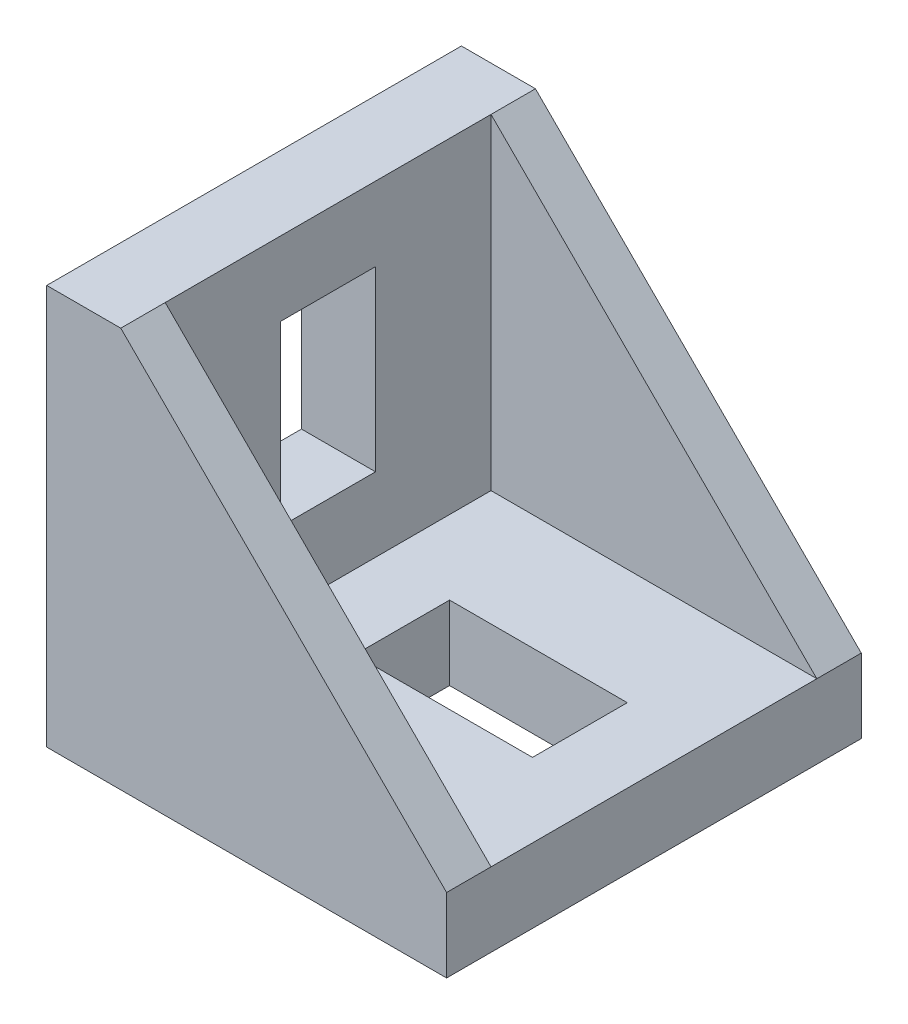
ISO-10303-21;
HEADER;
FILE_DESCRIPTION(('STEP AP214'),'2;1');
FILE_NAME('part.step','',(''),(''),'','','');
FILE_SCHEMA(('AUTOMOTIVE_DESIGN { 1 0 10303 214 1 1 1 1 }'));
ENDSEC;
DATA;
#1=APPLICATION_CONTEXT('core data for automotive mechanical design processes');
#2=APPLICATION_PROTOCOL_DEFINITION('international standard','automotive_design',2000,#1);
#3=PRODUCT_CONTEXT('',#1,'mechanical');
#4=PRODUCT('Part','Part','',(#3));
#5=PRODUCT_RELATED_PRODUCT_CATEGORY('part','',(#4));
#6=PRODUCT_DEFINITION_FORMATION('','',#4);
#7=PRODUCT_DEFINITION_CONTEXT('part definition',#1,'design');
#8=PRODUCT_DEFINITION('design','',#6,#7);
#9=PRODUCT_DEFINITION_SHAPE('','',#8);
#10=(LENGTH_UNIT() NAMED_UNIT(*) SI_UNIT(.MILLI.,.METRE.));
#11=(NAMED_UNIT(*) PLANE_ANGLE_UNIT() SI_UNIT($,.RADIAN.));
#12=(NAMED_UNIT(*) SI_UNIT($,.STERADIAN.) SOLID_ANGLE_UNIT());
#13=UNCERTAINTY_MEASURE_WITH_UNIT(LENGTH_MEASURE(1.E-05),#10,'distance_accuracy_value','');
#14=(GEOMETRIC_REPRESENTATION_CONTEXT(3) GLOBAL_UNCERTAINTY_ASSIGNED_CONTEXT((#13)) GLOBAL_UNIT_ASSIGNED_CONTEXT((#10,
#11,#12)) REPRESENTATION_CONTEXT('',''));
#15=CARTESIAN_POINT('',(0.,0.,0.));
#16=DIRECTION('',(0.,0.,1.));
#17=DIRECTION('',(1.,0.,0.));
#18=AXIS2_PLACEMENT_3D('',#15,#16,#17);
#19=CARTESIAN_POINT('',(0.,4.99999999999994,28.));
#20=DIRECTION('',(0.,1.,0.));
#21=DIRECTION('',(0.,0.,1.));
#22=AXIS2_PLACEMENT_3D('',#19,#20,#21);
#23=PLANE('',#22);
#24=DIRECTION('',(0.,0.,1.));
#25=VECTOR('',#24,1.);
#26=CARTESIAN_POINT('',(9.99999999999999,4.99999999999994,17.2));
#27=LINE('',#26,#25);
#28=CARTESIAN_POINT('',(9.99999999999999,4.99999999999994,10.8));
#29=VERTEX_POINT('',#28);
#30=CARTESIAN_POINT('',(9.99999999999999,4.99999999999994,17.2));
#31=VERTEX_POINT('',#30);
#32=EDGE_CURVE('E47',#29,#31,#27,.T.);
#33=ORIENTED_EDGE('',*,*,#32,.F.);
#34=DIRECTION('',(-1.,0.,0.));
#35=VECTOR('',#34,1.);
#36=CARTESIAN_POINT('',(22.,4.99999999999994,10.8));
#37=LINE('',#36,#35);
#38=CARTESIAN_POINT('',(22.,4.99999999999994,10.8));
#39=VERTEX_POINT('',#38);
#40=EDGE_CURVE('E162',#39,#29,#37,.T.);
#41=ORIENTED_EDGE('',*,*,#40,.F.);
#42=DIRECTION('',(0.,0.,-1.));
#43=VECTOR('',#42,1.);
#44=CARTESIAN_POINT('',(22.,4.99999999999994,17.2));
#45=LINE('',#44,#43);
#46=CARTESIAN_POINT('',(22.,4.99999999999994,17.2));
#47=VERTEX_POINT('',#46);
#48=EDGE_CURVE('E165',#47,#39,#45,.T.);
#49=ORIENTED_EDGE('',*,*,#48,.F.);
#50=DIRECTION('',(1.,0.,0.));
#51=VECTOR('',#50,1.);
#52=CARTESIAN_POINT('',(22.,4.99999999999994,17.2));
#53=LINE('',#52,#51);
#54=EDGE_CURVE('E171',#31,#47,#53,.T.);
#55=ORIENTED_EDGE('',*,*,#54,.F.);
#56=EDGE_LOOP('',(#33,#41,#49,#55));
#57=FACE_BOUND('',#56,.T.);
#58=DIRECTION('',(0.,0.,-1.));
#59=VECTOR('',#58,1.);
#60=CARTESIAN_POINT('',(5.,4.99999999999994,28.));
#61=LINE('',#60,#59);
#62=CARTESIAN_POINT('',(5.,4.99999999999994,25.));
#63=VERTEX_POINT('',#62);
#64=CARTESIAN_POINT('',(5.,4.99999999999994,3.));
#65=VERTEX_POINT('',#64);
#66=EDGE_CURVE('E11',#63,#65,#61,.T.);
#67=ORIENTED_EDGE('',*,*,#66,.F.);
#68=DIRECTION('',(1.,0.,0.));
#69=VECTOR('',#68,1.);
#70=CARTESIAN_POINT('',(27.,4.99999999999994,25.));
#71=LINE('',#70,#69);
#72=CARTESIAN_POINT('',(27.,4.99999999999994,25.));
#73=VERTEX_POINT('',#72);
#74=EDGE_CURVE('E215',#63,#73,#71,.T.);
#75=ORIENTED_EDGE('',*,*,#74,.T.);
#76=DIRECTION('',(0.,0.,-1.));
#77=VECTOR('',#76,1.);
#78=CARTESIAN_POINT('',(27.,4.99999999999994,28.));
#79=LINE('',#78,#77);
#80=CARTESIAN_POINT('',(27.,4.99999999999994,3.));
#81=VERTEX_POINT('',#80);
#82=EDGE_CURVE('E251',#73,#81,#79,.T.);
#83=ORIENTED_EDGE('',*,*,#82,.T.);
#84=DIRECTION('',(1.,0.,0.));
#85=VECTOR('',#84,1.);
#86=CARTESIAN_POINT('',(0.,4.99999999999994,3.));
#87=LINE('',#86,#85);
#88=EDGE_CURVE('E226',#65,#81,#87,.T.);
#89=ORIENTED_EDGE('',*,*,#88,.F.);
#90=EDGE_LOOP('',(#67,#75,#83,#89));
#91=FACE_BOUND('',#90,.T.);
#92=ADVANCED_FACE('F33',(#57,#91),#23,.T.);
#93=CARTESIAN_POINT('',(5.,0.,28.));
#94=DIRECTION('',(1.,0.,0.));
#95=DIRECTION('',(0.,0.,-1.));
#96=AXIS2_PLACEMENT_3D('',#93,#94,#95);
#97=PLANE('',#96);
#98=DIRECTION('',(0.,1.,0.));
#99=VECTOR('',#98,1.);
#100=CARTESIAN_POINT('',(5.,10.,10.8));
#101=LINE('',#100,#99);
#102=CARTESIAN_POINT('',(5.,10.,10.8));
#103=VERTEX_POINT('',#102);
#104=CARTESIAN_POINT('',(5.,22.,10.8));
#105=VERTEX_POINT('',#104);
#106=EDGE_CURVE('E177',#103,#105,#101,.T.);
#107=ORIENTED_EDGE('',*,*,#106,.F.);
#108=DIRECTION('',(0.,0.,-1.));
#109=VECTOR('',#108,1.);
#110=CARTESIAN_POINT('',(5.,10.,17.2));
#111=LINE('',#110,#109);
#112=CARTESIAN_POINT('',(5.,10.,17.2));
#113=VERTEX_POINT('',#112);
#114=EDGE_CURVE('E185',#113,#103,#111,.T.);
#115=ORIENTED_EDGE('',*,*,#114,.F.);
#116=DIRECTION('',(0.,-1.,0.));
#117=VECTOR('',#116,1.);
#118=CARTESIAN_POINT('',(5.,10.,17.2));
#119=LINE('',#118,#117);
#120=CARTESIAN_POINT('',(5.,22.,17.2));
#121=VERTEX_POINT('',#120);
#122=EDGE_CURVE('E199',#121,#113,#119,.T.);
#123=ORIENTED_EDGE('',*,*,#122,.F.);
#124=DIRECTION('',(0.,0.,1.));
#125=VECTOR('',#124,1.);
#126=CARTESIAN_POINT('',(5.,22.,17.2));
#127=LINE('',#126,#125);
#128=EDGE_CURVE('E196',#105,#121,#127,.T.);
#129=ORIENTED_EDGE('',*,*,#128,.F.);
#130=EDGE_LOOP('',(#107,#115,#123,#129));
#131=FACE_BOUND('',#130,.T.);
#132=DIRECTION('',(0.,0.,-1.));
#133=VECTOR('',#132,1.);
#134=CARTESIAN_POINT('',(5.,27.,28.));
#135=LINE('',#134,#133);
#136=CARTESIAN_POINT('',(5.,27.,25.));
#137=VERTEX_POINT('',#136);
#138=CARTESIAN_POINT('',(5.,27.,3.));
#139=VERTEX_POINT('',#138);
#140=EDGE_CURVE('E270',#137,#139,#135,.T.);
#141=ORIENTED_EDGE('',*,*,#140,.F.);
#142=DIRECTION('',(0.,-1.,0.));
#143=VECTOR('',#142,1.);
#144=CARTESIAN_POINT('',(5.,4.99999999999994,25.));
#145=LINE('',#144,#143);
#146=EDGE_CURVE('E213',#137,#63,#145,.T.);
#147=ORIENTED_EDGE('',*,*,#146,.T.);
#148=ORIENTED_EDGE('',*,*,#66,.T.);
#149=DIRECTION('',(0.,-1.,0.));
#150=VECTOR('',#149,1.);
#151=CARTESIAN_POINT('',(5.,0.,3.));
#152=LINE('',#151,#150);
#153=EDGE_CURVE('E223',#139,#65,#152,.T.);
#154=ORIENTED_EDGE('',*,*,#153,.F.);
#155=EDGE_LOOP('',(#141,#147,#148,#154));
#156=FACE_BOUND('',#155,.T.);
#157=ADVANCED_FACE('F287',(#131,#156),#97,.T.);
#158=CARTESIAN_POINT('',(0.,27.,28.));
#159=DIRECTION('',(0.,1.,0.));
#160=DIRECTION('',(0.,0.,1.));
#161=AXIS2_PLACEMENT_3D('',#158,#159,#160);
#162=PLANE('',#161);
#163=DIRECTION('',(1.,0.,0.));
#164=VECTOR('',#163,1.);
#165=CARTESIAN_POINT('',(0.,27.,0.));
#166=LINE('',#165,#164);
#167=CARTESIAN_POINT('',(0.,27.,0.));
#168=VERTEX_POINT('',#167);
#169=CARTESIAN_POINT('',(5.,27.,0.));
#170=VERTEX_POINT('',#169);
#171=EDGE_CURVE('E239',#168,#170,#166,.T.);
#172=ORIENTED_EDGE('',*,*,#171,.F.);
#173=DIRECTION('',(0.,0.,-1.));
#174=VECTOR('',#173,1.);
#175=CARTESIAN_POINT('',(0.,27.,28.));
#176=LINE('',#175,#174);
#177=CARTESIAN_POINT('',(0.,27.,28.));
#178=VERTEX_POINT('',#177);
#179=EDGE_CURVE('E269',#178,#168,#176,.T.);
#180=ORIENTED_EDGE('',*,*,#179,.F.);
#181=DIRECTION('',(1.,0.,0.));
#182=VECTOR('',#181,1.);
#183=CARTESIAN_POINT('',(0.,27.,28.));
#184=LINE('',#183,#182);
#185=CARTESIAN_POINT('',(5.,27.,28.));
#186=VERTEX_POINT('',#185);
#187=EDGE_CURVE('E240',#178,#186,#184,.T.);
#188=ORIENTED_EDGE('',*,*,#187,.T.);
#189=EDGE_CURVE('E40',#186,#137,#135,.T.);
#190=ORIENTED_EDGE('',*,*,#189,.T.);
#191=ORIENTED_EDGE('',*,*,#140,.T.);
#192=DIRECTION('',(0.,0.,-1.));
#193=VECTOR('',#192,1.);
#194=CARTESIAN_POINT('',(5.,27.,3.));
#195=LINE('',#194,#193);
#196=EDGE_CURVE('E232',#139,#170,#195,.T.);
#197=ORIENTED_EDGE('',*,*,#196,.T.);
#198=EDGE_LOOP('',(#172,#180,#188,#190,#191,#197));
#199=FACE_BOUND('',#198,.T.);
#200=ADVANCED_FACE('F277',(#199),#162,.T.);
#201=CARTESIAN_POINT('',(0.,0.,28.));
#202=DIRECTION('',(-1.,0.,0.));
#203=DIRECTION('',(0.,0.,1.));
#204=AXIS2_PLACEMENT_3D('',#201,#202,#203);
#205=PLANE('',#204);
#206=DIRECTION('',(0.,1.,0.));
#207=VECTOR('',#206,1.);
#208=CARTESIAN_POINT('',(0.,10.,10.8));
#209=LINE('',#208,#207);
#210=CARTESIAN_POINT('',(0.,10.,10.8));
#211=VERTEX_POINT('',#210);
#212=CARTESIAN_POINT('',(0.,22.,10.8));
#213=VERTEX_POINT('',#212);
#214=EDGE_CURVE('E181',#211,#213,#209,.T.);
#215=ORIENTED_EDGE('',*,*,#214,.T.);
#216=DIRECTION('',(0.,0.,1.));
#217=VECTOR('',#216,1.);
#218=CARTESIAN_POINT('',(0.,22.,17.2));
#219=LINE('',#218,#217);
#220=CARTESIAN_POINT('',(0.,22.,17.2));
#221=VERTEX_POINT('',#220);
#222=EDGE_CURVE('E184',#213,#221,#219,.T.);
#223=ORIENTED_EDGE('',*,*,#222,.T.);
#224=DIRECTION('',(0.,-1.,0.));
#225=VECTOR('',#224,1.);
#226=CARTESIAN_POINT('',(0.,10.,17.2));
#227=LINE('',#226,#225);
#228=CARTESIAN_POINT('',(0.,10.,17.2));
#229=VERTEX_POINT('',#228);
#230=EDGE_CURVE('E188',#221,#229,#227,.T.);
#231=ORIENTED_EDGE('',*,*,#230,.T.);
#232=DIRECTION('',(0.,0.,-1.));
#233=VECTOR('',#232,1.);
#234=CARTESIAN_POINT('',(0.,10.,17.2));
#235=LINE('',#234,#233);
#236=EDGE_CURVE('E191',#229,#211,#235,.T.);
#237=ORIENTED_EDGE('',*,*,#236,.T.);
#238=EDGE_LOOP('',(#215,#223,#231,#237));
#239=FACE_BOUND('',#238,.T.);
#240=DIRECTION('',(0.,1.,0.));
#241=VECTOR('',#240,1.);
#242=CARTESIAN_POINT('',(0.,0.,0.));
#243=LINE('',#242,#241);
#244=CARTESIAN_POINT('',(0.,0.,0.));
#245=VERTEX_POINT('',#244);
#246=EDGE_CURVE('E254',#245,#168,#243,.T.);
#247=ORIENTED_EDGE('',*,*,#246,.F.);
#248=DIRECTION('',(0.,0.,-1.));
#249=VECTOR('',#248,1.);
#250=CARTESIAN_POINT('',(0.,0.,28.));
#251=LINE('',#250,#249);
#252=CARTESIAN_POINT('',(0.,0.,28.));
#253=VERTEX_POINT('',#252);
#254=EDGE_CURVE('E267',#253,#245,#251,.T.);
#255=ORIENTED_EDGE('',*,*,#254,.F.);
#256=DIRECTION('',(0.,1.,0.));
#257=VECTOR('',#256,1.);
#258=CARTESIAN_POINT('',(0.,0.,28.));
#259=LINE('',#258,#257);
#260=EDGE_CURVE('E242',#253,#178,#259,.T.);
#261=ORIENTED_EDGE('',*,*,#260,.T.);
#262=ORIENTED_EDGE('',*,*,#179,.T.);
#263=EDGE_LOOP('',(#247,#255,#261,#262));
#264=FACE_BOUND('',#263,.T.);
#265=ADVANCED_FACE('F313',(#239,#264),#205,.T.);
#266=CARTESIAN_POINT('',(0.,0.,28.));
#267=DIRECTION('',(0.,1.,0.));
#268=DIRECTION('',(0.,0.,1.));
#269=AXIS2_PLACEMENT_3D('',#266,#267,#268);
#270=PLANE('',#269);
#271=DIRECTION('',(-1.,0.,0.));
#272=VECTOR('',#271,1.);
#273=CARTESIAN_POINT('',(22.,0.,10.8));
#274=LINE('',#273,#272);
#275=CARTESIAN_POINT('',(22.,0.,10.8));
#276=VERTEX_POINT('',#275);
#277=CARTESIAN_POINT('',(9.99999999999999,0.,10.8));
#278=VERTEX_POINT('',#277);
#279=EDGE_CURVE('E152',#276,#278,#274,.T.);
#280=ORIENTED_EDGE('',*,*,#279,.T.);
#281=DIRECTION('',(0.,0.,1.));
#282=VECTOR('',#281,1.);
#283=CARTESIAN_POINT('',(9.99999999999999,0.,17.2));
#284=LINE('',#283,#282);
#285=CARTESIAN_POINT('',(9.99999999999999,0.,17.2));
#286=VERTEX_POINT('',#285);
#287=EDGE_CURVE('E146',#278,#286,#284,.T.);
#288=ORIENTED_EDGE('',*,*,#287,.T.);
#289=DIRECTION('',(1.,0.,0.));
#290=VECTOR('',#289,1.);
#291=CARTESIAN_POINT('',(22.,0.,17.2));
#292=LINE('',#291,#290);
#293=CARTESIAN_POINT('',(22.,0.,17.2));
#294=VERTEX_POINT('',#293);
#295=EDGE_CURVE('E155',#286,#294,#292,.T.);
#296=ORIENTED_EDGE('',*,*,#295,.T.);
#297=DIRECTION('',(0.,0.,-1.));
#298=VECTOR('',#297,1.);
#299=CARTESIAN_POINT('',(22.,0.,17.2));
#300=LINE('',#299,#298);
#301=EDGE_CURVE('E55',#294,#276,#300,.T.);
#302=ORIENTED_EDGE('',*,*,#301,.T.);
#303=EDGE_LOOP('',(#280,#288,#296,#302));
#304=FACE_BOUND('',#303,.T.);
#305=DIRECTION('',(1.,0.,0.));
#306=VECTOR('',#305,1.);
#307=CARTESIAN_POINT('',(0.,0.,0.));
#308=LINE('',#307,#306);
#309=CARTESIAN_POINT('',(27.,0.,0.));
#310=VERTEX_POINT('',#309);
#311=EDGE_CURVE('E257',#245,#310,#308,.T.);
#312=ORIENTED_EDGE('',*,*,#311,.T.);
#313=DIRECTION('',(0.,0.,-1.));
#314=VECTOR('',#313,1.);
#315=CARTESIAN_POINT('',(27.,0.,28.));
#316=LINE('',#315,#314);
#317=CARTESIAN_POINT('',(27.,0.,28.));
#318=VERTEX_POINT('',#317);
#319=EDGE_CURVE('E264',#318,#310,#316,.T.);
#320=ORIENTED_EDGE('',*,*,#319,.F.);
#321=DIRECTION('',(1.,0.,0.));
#322=VECTOR('',#321,1.);
#323=CARTESIAN_POINT('',(0.,0.,28.));
#324=LINE('',#323,#322);
#325=EDGE_CURVE('E246',#253,#318,#324,.T.);
#326=ORIENTED_EDGE('',*,*,#325,.F.);
#327=ORIENTED_EDGE('',*,*,#254,.T.);
#328=EDGE_LOOP('',(#312,#320,#326,#327));
#329=FACE_BOUND('',#328,.T.);
#330=ADVANCED_FACE('F159',(#304,#329),#270,.F.);
#331=CARTESIAN_POINT('',(27.,0.,28.));
#332=DIRECTION('',(-1.,0.,0.));
#333=DIRECTION('',(0.,-1.,0.));
#334=AXIS2_PLACEMENT_3D('',#331,#332,#333);
#335=PLANE('',#334);
#336=DIRECTION('',(0.,1.,0.));
#337=VECTOR('',#336,1.);
#338=CARTESIAN_POINT('',(27.,0.,0.));
#339=LINE('',#338,#337);
#340=CARTESIAN_POINT('',(27.,4.99999999999994,0.));
#341=VERTEX_POINT('',#340);
#342=EDGE_CURVE('E243',#310,#341,#339,.T.);
#343=ORIENTED_EDGE('',*,*,#342,.T.);
#344=DIRECTION('',(0.,0.,-1.));
#345=VECTOR('',#344,1.);
#346=CARTESIAN_POINT('',(27.,4.99999999999994,3.));
#347=LINE('',#346,#345);
#348=EDGE_CURVE('E236',#81,#341,#347,.T.);
#349=ORIENTED_EDGE('',*,*,#348,.F.);
#350=ORIENTED_EDGE('',*,*,#82,.F.);
#351=CARTESIAN_POINT('',(27.,4.99999999999994,28.));
#352=VERTEX_POINT('',#351);
#353=EDGE_CURVE('E261',#352,#73,#79,.T.);
#354=ORIENTED_EDGE('',*,*,#353,.F.);
#355=DIRECTION('',(0.,1.,0.));
#356=VECTOR('',#355,1.);
#357=CARTESIAN_POINT('',(27.,0.,28.));
#358=LINE('',#357,#356);
#359=EDGE_CURVE('E248',#318,#352,#358,.T.);
#360=ORIENTED_EDGE('',*,*,#359,.F.);
#361=ORIENTED_EDGE('',*,*,#319,.T.);
#362=EDGE_LOOP('',(#343,#349,#350,#354,#360,#361));
#363=FACE_BOUND('',#362,.T.);
#364=ADVANCED_FACE('F300',(#363),#335,.F.);
#365=CARTESIAN_POINT('',(0.,0.,28.));
#366=DIRECTION('',(0.,0.,1.));
#367=DIRECTION('',(1.,0.,0.));
#368=AXIS2_PLACEMENT_3D('',#365,#366,#367);
#369=PLANE('',#368);
#370=ORIENTED_EDGE('',*,*,#359,.T.);
#371=DIRECTION('',(-0.707106781186546,0.707106781186549,0.));
#372=VECTOR('',#371,1.);
#373=CARTESIAN_POINT('',(5.,27.,28.));
#374=LINE('',#373,#372);
#375=EDGE_CURVE('E206',#352,#186,#374,.T.);
#376=ORIENTED_EDGE('',*,*,#375,.T.);
#377=ORIENTED_EDGE('',*,*,#187,.F.);
#378=ORIENTED_EDGE('',*,*,#260,.F.);
#379=ORIENTED_EDGE('',*,*,#325,.T.);
#380=EDGE_LOOP('',(#370,#376,#377,#378,#379));
#381=FACE_BOUND('',#380,.T.);
#382=ADVANCED_FACE('F302',(#381),#369,.T.);
#383=CARTESIAN_POINT('',(0.,0.,0.));
#384=DIRECTION('',(0.,0.,1.));
#385=DIRECTION('',(1.,0.,0.));
#386=AXIS2_PLACEMENT_3D('',#383,#384,#385);
#387=PLANE('',#386);
#388=ORIENTED_EDGE('',*,*,#171,.T.);
#389=DIRECTION('',(0.707106781186546,-0.707106781186549,0.));
#390=VECTOR('',#389,1.);
#391=CARTESIAN_POINT('',(16.,16.,0.));
#392=LINE('',#391,#390);
#393=EDGE_CURVE('E220',#170,#341,#392,.T.);
#394=ORIENTED_EDGE('',*,*,#393,.T.);
#395=ORIENTED_EDGE('',*,*,#342,.F.);
#396=ORIENTED_EDGE('',*,*,#311,.F.);
#397=ORIENTED_EDGE('',*,*,#246,.T.);
#398=EDGE_LOOP('',(#388,#394,#395,#396,#397));
#399=FACE_BOUND('',#398,.T.);
#400=ADVANCED_FACE('F310',(#399),#387,.F.);
#401=CARTESIAN_POINT('',(16.,16.,3.));
#402=DIRECTION('',(0.707106781186548,0.707106781186546,0.));
#403=DIRECTION('',(-0.707106781186546,0.707106781186549,0.));
#404=AXIS2_PLACEMENT_3D('',#401,#402,#403);
#405=PLANE('',#404);
#406=ORIENTED_EDGE('',*,*,#393,.F.);
#407=ORIENTED_EDGE('',*,*,#196,.F.);
#408=DIRECTION('',(0.707106781186546,-0.707106781186549,0.));
#409=VECTOR('',#408,1.);
#410=CARTESIAN_POINT('',(16.,16.,3.));
#411=LINE('',#410,#409);
#412=EDGE_CURVE('E229',#139,#81,#411,.T.);
#413=ORIENTED_EDGE('',*,*,#412,.T.);
#414=ORIENTED_EDGE('',*,*,#348,.T.);
#415=EDGE_LOOP('',(#406,#407,#413,#414));
#416=FACE_BOUND('',#415,.T.);
#417=ADVANCED_FACE('F282',(#416),#405,.T.);
#418=CARTESIAN_POINT('',(0.,0.,3.));
#419=DIRECTION('',(0.,0.,1.));
#420=DIRECTION('',(1.,0.,0.));
#421=AXIS2_PLACEMENT_3D('',#418,#419,#420);
#422=PLANE('',#421);
#423=ORIENTED_EDGE('',*,*,#153,.T.);
#424=ORIENTED_EDGE('',*,*,#88,.T.);
#425=ORIENTED_EDGE('',*,*,#412,.F.);
#426=EDGE_LOOP('',(#423,#424,#425));
#427=FACE_BOUND('',#426,.T.);
#428=ADVANCED_FACE('F285',(#427),#422,.T.);
#429=CARTESIAN_POINT('',(5.,27.,25.));
#430=DIRECTION('',(0.707106781186548,0.707106781186546,0.));
#431=DIRECTION('',(-0.707106781186546,0.707106781186549,0.));
#432=AXIS2_PLACEMENT_3D('',#429,#430,#431);
#433=PLANE('',#432);
#434=ORIENTED_EDGE('',*,*,#375,.F.);
#435=ORIENTED_EDGE('',*,*,#353,.T.);
#436=DIRECTION('',(-0.707106781186546,0.707106781186549,0.));
#437=VECTOR('',#436,1.);
#438=CARTESIAN_POINT('',(5.,27.,25.));
#439=LINE('',#438,#437);
#440=EDGE_CURVE('E217',#73,#137,#439,.T.);
#441=ORIENTED_EDGE('',*,*,#440,.T.);
#442=ORIENTED_EDGE('',*,*,#189,.F.);
#443=EDGE_LOOP('',(#434,#435,#441,#442));
#444=FACE_BOUND('',#443,.T.);
#445=ADVANCED_FACE('F297',(#444),#433,.T.);
#446=CARTESIAN_POINT('',(0.,0.,25.));
#447=DIRECTION('',(0.,0.,1.));
#448=DIRECTION('',(1.,0.,0.));
#449=AXIS2_PLACEMENT_3D('',#446,#447,#448);
#450=PLANE('',#449);
#451=ORIENTED_EDGE('',*,*,#146,.F.);
#452=ORIENTED_EDGE('',*,*,#440,.F.);
#453=ORIENTED_EDGE('',*,*,#74,.F.);
#454=EDGE_LOOP('',(#451,#452,#453));
#455=FACE_BOUND('',#454,.T.);
#456=ADVANCED_FACE('F294',(#455),#450,.F.);
#457=CARTESIAN_POINT('',(0.,10.,10.8));
#458=DIRECTION('',(0.,0.,-1.));
#459=DIRECTION('',(-1.,0.,0.));
#460=AXIS2_PLACEMENT_3D('',#457,#458,#459);
#461=PLANE('',#460);
#462=ORIENTED_EDGE('',*,*,#106,.T.);
#463=DIRECTION('',(1.,0.,0.));
#464=VECTOR('',#463,1.);
#465=CARTESIAN_POINT('',(0.,22.,10.8));
#466=LINE('',#465,#464);
#467=EDGE_CURVE('E194',#213,#105,#466,.T.);
#468=ORIENTED_EDGE('',*,*,#467,.F.);
#469=ORIENTED_EDGE('',*,*,#214,.F.);
#470=DIRECTION('',(1.,0.,0.));
#471=VECTOR('',#470,1.);
#472=CARTESIAN_POINT('',(0.,10.,10.8));
#473=LINE('',#472,#471);
#474=EDGE_CURVE('E204',#211,#103,#473,.T.);
#475=ORIENTED_EDGE('',*,*,#474,.T.);
#476=EDGE_LOOP('',(#462,#468,#469,#475));
#477=FACE_BOUND('',#476,.T.);
#478=ADVANCED_FACE('F350',(#477),#461,.F.);
#479=CARTESIAN_POINT('',(0.,10.,17.2));
#480=DIRECTION('',(0.,-1.,0.));
#481=DIRECTION('',(0.,0.,-1.));
#482=AXIS2_PLACEMENT_3D('',#479,#480,#481);
#483=PLANE('',#482);
#484=ORIENTED_EDGE('',*,*,#114,.T.);
#485=ORIENTED_EDGE('',*,*,#474,.F.);
#486=ORIENTED_EDGE('',*,*,#236,.F.);
#487=DIRECTION('',(1.,0.,0.));
#488=VECTOR('',#487,1.);
#489=CARTESIAN_POINT('',(0.,10.,17.2));
#490=LINE('',#489,#488);
#491=EDGE_CURVE('E207',#229,#113,#490,.T.);
#492=ORIENTED_EDGE('',*,*,#491,.T.);
#493=EDGE_LOOP('',(#484,#485,#486,#492));
#494=FACE_BOUND('',#493,.T.);
#495=ADVANCED_FACE('F346',(#494),#483,.F.);
#496=CARTESIAN_POINT('',(0.,10.,17.2));
#497=DIRECTION('',(0.,0.,1.));
#498=DIRECTION('',(1.,0.,0.));
#499=AXIS2_PLACEMENT_3D('',#496,#497,#498);
#500=PLANE('',#499);
#501=ORIENTED_EDGE('',*,*,#122,.T.);
#502=ORIENTED_EDGE('',*,*,#491,.F.);
#503=ORIENTED_EDGE('',*,*,#230,.F.);
#504=DIRECTION('',(1.,0.,0.));
#505=VECTOR('',#504,1.);
#506=CARTESIAN_POINT('',(0.,22.,17.2));
#507=LINE('',#506,#505);
#508=EDGE_CURVE('E209',#221,#121,#507,.T.);
#509=ORIENTED_EDGE('',*,*,#508,.T.);
#510=EDGE_LOOP('',(#501,#502,#503,#509));
#511=FACE_BOUND('',#510,.T.);
#512=ADVANCED_FACE('F349',(#511),#500,.F.);
#513=CARTESIAN_POINT('',(0.,22.,17.2));
#514=DIRECTION('',(0.,1.,0.));
#515=DIRECTION('',(0.,0.,1.));
#516=AXIS2_PLACEMENT_3D('',#513,#514,#515);
#517=PLANE('',#516);
#518=ORIENTED_EDGE('',*,*,#128,.T.);
#519=ORIENTED_EDGE('',*,*,#508,.F.);
#520=ORIENTED_EDGE('',*,*,#222,.F.);
#521=ORIENTED_EDGE('',*,*,#467,.T.);
#522=EDGE_LOOP('',(#518,#519,#520,#521));
#523=FACE_BOUND('',#522,.T.);
#524=ADVANCED_FACE('F341',(#523),#517,.F.);
#525=CARTESIAN_POINT('',(9.99999999999999,0.,17.2));
#526=DIRECTION('',(-1.,0.,0.));
#527=DIRECTION('',(0.,0.,1.));
#528=AXIS2_PLACEMENT_3D('',#525,#526,#527);
#529=PLANE('',#528);
#530=ORIENTED_EDGE('',*,*,#32,.T.);
#531=DIRECTION('',(0.,1.,0.));
#532=VECTOR('',#531,1.);
#533=CARTESIAN_POINT('',(9.99999999999999,0.,17.2));
#534=LINE('',#533,#532);
#535=EDGE_CURVE('E142',#286,#31,#534,.T.);
#536=ORIENTED_EDGE('',*,*,#535,.F.);
#537=ORIENTED_EDGE('',*,*,#287,.F.);
#538=DIRECTION('',(0.,1.,0.));
#539=VECTOR('',#538,1.);
#540=CARTESIAN_POINT('',(9.99999999999999,0.,10.8));
#541=LINE('',#540,#539);
#542=EDGE_CURVE('E175',#278,#29,#541,.T.);
#543=ORIENTED_EDGE('',*,*,#542,.T.);
#544=EDGE_LOOP('',(#530,#536,#537,#543));
#545=FACE_BOUND('',#544,.T.);
#546=ADVANCED_FACE('F144',(#545),#529,.F.);
#547=CARTESIAN_POINT('',(22.,0.,10.8));
#548=DIRECTION('',(0.,0.,-1.));
#549=DIRECTION('',(-1.,0.,0.));
#550=AXIS2_PLACEMENT_3D('',#547,#548,#549);
#551=PLANE('',#550);
#552=ORIENTED_EDGE('',*,*,#40,.T.);
#553=ORIENTED_EDGE('',*,*,#542,.F.);
#554=ORIENTED_EDGE('',*,*,#279,.F.);
#555=DIRECTION('',(0.,1.,0.));
#556=VECTOR('',#555,1.);
#557=CARTESIAN_POINT('',(22.,0.,10.8));
#558=LINE('',#557,#556);
#559=EDGE_CURVE('E178',#276,#39,#558,.T.);
#560=ORIENTED_EDGE('',*,*,#559,.T.);
#561=EDGE_LOOP('',(#552,#553,#554,#560));
#562=FACE_BOUND('',#561,.T.);
#563=ADVANCED_FACE('F333',(#562),#551,.F.);
#564=CARTESIAN_POINT('',(22.,0.,17.2));
#565=DIRECTION('',(1.,0.,0.));
#566=DIRECTION('',(0.,0.,-1.));
#567=AXIS2_PLACEMENT_3D('',#564,#565,#566);
#568=PLANE('',#567);
#569=ORIENTED_EDGE('',*,*,#48,.T.);
#570=ORIENTED_EDGE('',*,*,#559,.F.);
#571=ORIENTED_EDGE('',*,*,#301,.F.);
#572=DIRECTION('',(0.,1.,0.));
#573=VECTOR('',#572,1.);
#574=CARTESIAN_POINT('',(22.,0.,17.2));
#575=LINE('',#574,#573);
#576=EDGE_CURVE('E151',#294,#47,#575,.T.);
#577=ORIENTED_EDGE('',*,*,#576,.T.);
#578=EDGE_LOOP('',(#569,#570,#571,#577));
#579=FACE_BOUND('',#578,.T.);
#580=ADVANCED_FACE('F331',(#579),#568,.F.);
#581=CARTESIAN_POINT('',(22.,0.,17.2));
#582=DIRECTION('',(0.,0.,1.));
#583=DIRECTION('',(1.,0.,0.));
#584=AXIS2_PLACEMENT_3D('',#581,#582,#583);
#585=PLANE('',#584);
#586=ORIENTED_EDGE('',*,*,#54,.T.);
#587=ORIENTED_EDGE('',*,*,#576,.F.);
#588=ORIENTED_EDGE('',*,*,#295,.F.);
#589=ORIENTED_EDGE('',*,*,#535,.T.);
#590=EDGE_LOOP('',(#586,#587,#588,#589));
#591=FACE_BOUND('',#590,.T.);
#592=ADVANCED_FACE('F156',(#591),#585,.F.);
#593=CLOSED_SHELL('',(#92,#157,#200,#265,#330,#364,#382,#400,#417,#428,#445,#456,#478,#495,#512,
#524,#546,#563,#580,#592));
#594=MANIFOLD_SOLID_BREP('B2',#593);
#595=ADVANCED_BREP_SHAPE_REPRESENTATION('',(#18,#594),#14);
#596=SHAPE_DEFINITION_REPRESENTATION(#9,#595);
ENDSEC;
END-ISO-10303-21;
